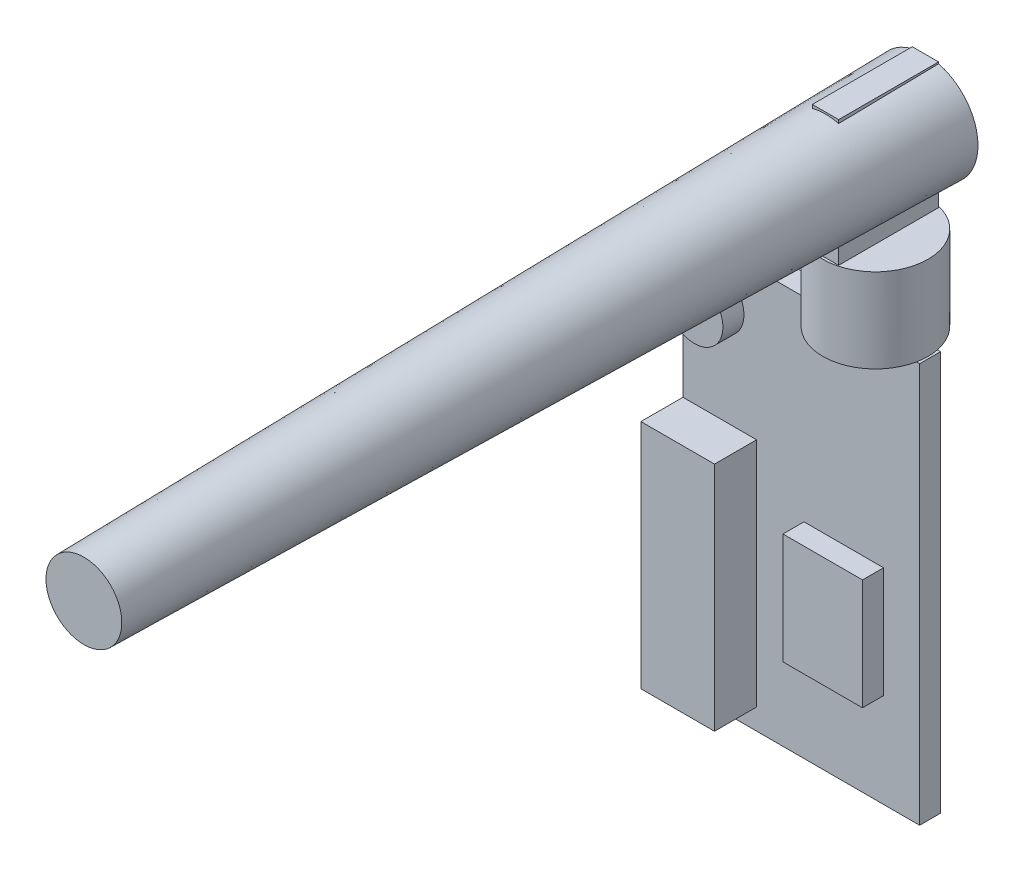
ISO-10303-21;
HEADER;
FILE_DESCRIPTION(('STEP AP214'),'2;1');
FILE_NAME('part.step','',(''),(''),'','','');
FILE_SCHEMA(('AUTOMOTIVE_DESIGN { 1 0 10303 214 1 1 1 1 }'));
ENDSEC;
DATA;
#1=APPLICATION_CONTEXT('core data for automotive mechanical design processes');
#2=APPLICATION_PROTOCOL_DEFINITION('international standard','automotive_design',2000,#1);
#3=PRODUCT_CONTEXT('',#1,'mechanical');
#4=PRODUCT('Part','Part','',(#3));
#5=PRODUCT_RELATED_PRODUCT_CATEGORY('part','',(#4));
#6=PRODUCT_DEFINITION_FORMATION('','',#4);
#7=PRODUCT_DEFINITION_CONTEXT('part definition',#1,'design');
#8=PRODUCT_DEFINITION('design','',#6,#7);
#9=PRODUCT_DEFINITION_SHAPE('','',#8);
#10=(LENGTH_UNIT() NAMED_UNIT(*) SI_UNIT(.MILLI.,.METRE.));
#11=(NAMED_UNIT(*) PLANE_ANGLE_UNIT() SI_UNIT($,.RADIAN.));
#12=(NAMED_UNIT(*) SI_UNIT($,.STERADIAN.) SOLID_ANGLE_UNIT());
#13=UNCERTAINTY_MEASURE_WITH_UNIT(LENGTH_MEASURE(1.E-05),#10,'distance_accuracy_value','');
#14=(GEOMETRIC_REPRESENTATION_CONTEXT(3) GLOBAL_UNCERTAINTY_ASSIGNED_CONTEXT((#13)) GLOBAL_UNIT_ASSIGNED_CONTEXT((#10,
#11,#12)) REPRESENTATION_CONTEXT('',''));
#15=CARTESIAN_POINT('',(0.,0.,0.));
#16=DIRECTION('',(0.,0.,1.));
#17=DIRECTION('',(1.,0.,0.));
#18=AXIS2_PLACEMENT_3D('',#15,#16,#17);
#19=CARTESIAN_POINT('',(7.3,27.,5.75));
#20=DIRECTION('',(1.,0.,0.));
#21=DIRECTION('',(0.,0.,-1.));
#22=AXIS2_PLACEMENT_3D('',#19,#20,#21);
#23=PLANE('',#22);
#24=CARTESIAN_POINT('',(7.3,29.0042749445332,-12.3283027239144));
#25=CARTESIAN_POINT('',(7.3,29.0629664221397,-9.06648061269329));
#26=CARTESIAN_POINT('',(7.3,29.1217172337511,-5.80465956799577));
#27=CARTESIAN_POINT('',(7.3,29.2393547379054,0.718980071111044));
#28=CARTESIAN_POINT('',(7.3,29.2982414304482,3.98079866552035));
#29=CARTESIAN_POINT('',(7.3,29.5084515527823,15.6095185434133));
#30=CARTESIAN_POINT('',(7.3,29.6602020962048,23.9764121052414));
#31=CARTESIAN_POINT('',(7.3,29.8126015581077,32.34329388351));
#32=B_SPLINE_CURVE_WITH_KNOTS('',3,(#24,#25,#26,#27,#28,#29,#30,#31),.UNSPECIFIED.,.F.,.F.,(4,2,
2,4),(0.,9.78705030118873,19.5741006026884,44.6789093603624),.UNSPECIFIED.);
#33=CARTESIAN_POINT('',(7.3,29.3302284704827,5.75));
#34=VERTEX_POINT('',#33);
#35=CARTESIAN_POINT('',(7.3,29.1587708172407,-3.75));
#36=VERTEX_POINT('',#35);
#37=EDGE_CURVE('E220',#34,#36,#32,.F.);
#38=ORIENTED_EDGE('',*,*,#37,.F.);
#39=DIRECTION('',(0.,1.,0.));
#40=VECTOR('',#39,1.);
#41=CARTESIAN_POINT('',(7.3,27.,5.75));
#42=LINE('',#41,#40);
#43=CARTESIAN_POINT('',(7.3,27.,5.75));
#44=VERTEX_POINT('',#43);
#45=EDGE_CURVE('E651',#44,#34,#42,.T.);
#46=ORIENTED_EDGE('',*,*,#45,.F.);
#47=DIRECTION('',(0.,0.,-1.));
#48=VECTOR('',#47,1.);
#49=CARTESIAN_POINT('',(7.3,27.,5.75));
#50=LINE('',#49,#48);
#51=CARTESIAN_POINT('',(7.3,27.,-3.75));
#52=VERTEX_POINT('',#51);
#53=EDGE_CURVE('E636',#44,#52,#50,.T.);
#54=ORIENTED_EDGE('',*,*,#53,.T.);
#55=DIRECTION('',(0.,1.,0.));
#56=VECTOR('',#55,1.);
#57=CARTESIAN_POINT('',(7.3,27.,-3.75));
#58=LINE('',#57,#56);
#59=EDGE_CURVE('E235',#52,#36,#58,.T.);
#60=ORIENTED_EDGE('',*,*,#59,.T.);
#61=EDGE_LOOP('',(#38,#46,#54,#60));
#62=FACE_BOUND('',#61,.T.);
#63=ADVANCED_FACE('F36',(#62),#23,.T.);
#64=CARTESIAN_POINT('',(4.8,27.,5.75));
#65=DIRECTION('',(0.,0.,1.));
#66=DIRECTION('',(1.,0.,0.));
#67=AXIS2_PLACEMENT_3D('',#64,#65,#66);
#68=PLANE('',#67);
#69=CARTESIAN_POINT('',(6.05,34.,5.75));
#70=DIRECTION('',(0.,0.,1.));
#71=DIRECTION('',(1.,0.,0.));
#72=AXIS2_PLACEMENT_3D('',#69,#70,#71);
#73=CIRCLE('',#72,4.83417688318193);
#74=CARTESIAN_POINT('',(7.3,38.6697715295173,5.75));
#75=VERTEX_POINT('',#74);
#76=CARTESIAN_POINT('',(4.8,38.6697715295173,5.75));
#77=VERTEX_POINT('',#76);
#78=EDGE_CURVE('E232',#75,#77,#73,.T.);
#79=ORIENTED_EDGE('',*,*,#78,.F.);
#80=CARTESIAN_POINT('',(7.3,39.,5.75));
#81=VERTEX_POINT('',#80);
#82=EDGE_CURVE('E230',#75,#81,#42,.T.);
#83=ORIENTED_EDGE('',*,*,#82,.T.);
#84=DIRECTION('',(1.,0.,0.));
#85=VECTOR('',#84,1.);
#86=CARTESIAN_POINT('',(4.8,39.,5.75));
#87=LINE('',#86,#85);
#88=CARTESIAN_POINT('',(4.8,39.,5.75));
#89=VERTEX_POINT('',#88);
#90=EDGE_CURVE('E640',#89,#81,#87,.T.);
#91=ORIENTED_EDGE('',*,*,#90,.F.);
#92=DIRECTION('',(0.,1.,0.));
#93=VECTOR('',#92,1.);
#94=CARTESIAN_POINT('',(4.8,27.,5.75));
#95=LINE('',#94,#93);
#96=EDGE_CURVE('E655',#77,#89,#95,.T.);
#97=ORIENTED_EDGE('',*,*,#96,.F.);
#98=EDGE_LOOP('',(#79,#83,#91,#97));
#99=FACE_BOUND('',#98,.T.);
#100=ADVANCED_FACE('F420',(#99),#68,.T.);
#101=CARTESIAN_POINT('',(4.8,27.,5.75));
#102=DIRECTION('',(-1.,0.,0.));
#103=DIRECTION('',(0.,0.,1.));
#104=AXIS2_PLACEMENT_3D('',#101,#102,#103);
#105=PLANE('',#104);
#106=CARTESIAN_POINT('',(4.8,29.0042749445332,-12.3283027239144));
#107=CARTESIAN_POINT('',(4.8,29.0629664221397,-9.06648061269329));
#108=CARTESIAN_POINT('',(4.8,29.1217172337511,-5.80465956799577));
#109=CARTESIAN_POINT('',(4.8,29.2393547379054,0.718980071111044));
#110=CARTESIAN_POINT('',(4.8,29.2982414304482,3.98079866552035));
#111=CARTESIAN_POINT('',(4.8,29.5084515527823,15.6095185434133));
#112=CARTESIAN_POINT('',(4.8,29.6602020962048,23.9764121052414));
#113=CARTESIAN_POINT('',(4.8,29.8126015581077,32.34329388351));
#114=B_SPLINE_CURVE_WITH_KNOTS('',3,(#106,#107,#108,#109,#110,#111,#112,#113),.UNSPECIFIED.,.F.,
.F.,(4,2,2,4),(0.,9.78705030118873,19.5741006026884,44.6789093603624),.UNSPECIFIED.);
#115=CARTESIAN_POINT('',(4.8,29.1587708172407,-3.75));
#116=VERTEX_POINT('',#115);
#117=CARTESIAN_POINT('',(4.8,29.3302284704827,5.75));
#118=VERTEX_POINT('',#117);
#119=EDGE_CURVE('E231',#116,#118,#114,.T.);
#120=ORIENTED_EDGE('',*,*,#119,.F.);
#121=DIRECTION('',(0.,1.,0.));
#122=VECTOR('',#121,1.);
#123=CARTESIAN_POINT('',(4.8,27.,-3.75));
#124=LINE('',#123,#122);
#125=CARTESIAN_POINT('',(4.8,27.,-3.75));
#126=VERTEX_POINT('',#125);
#127=EDGE_CURVE('E243',#126,#116,#124,.T.);
#128=ORIENTED_EDGE('',*,*,#127,.F.);
#129=DIRECTION('',(0.,0.,1.));
#130=VECTOR('',#129,1.);
#131=CARTESIAN_POINT('',(4.8,27.,5.75));
#132=LINE('',#131,#130);
#133=CARTESIAN_POINT('',(4.8,27.,5.75));
#134=VERTEX_POINT('',#133);
#135=EDGE_CURVE('E240',#126,#134,#132,.T.);
#136=ORIENTED_EDGE('',*,*,#135,.T.);
#137=EDGE_CURVE('E653',#134,#118,#95,.T.);
#138=ORIENTED_EDGE('',*,*,#137,.T.);
#139=EDGE_LOOP('',(#120,#128,#136,#138));
#140=FACE_BOUND('',#139,.T.);
#141=ADVANCED_FACE('F426',(#140),#105,.T.);
#142=CARTESIAN_POINT('',(6.05,39.,1.));
#143=DIRECTION('',(0.,-1.,0.));
#144=DIRECTION('',(0.,0.,-1.));
#145=AXIS2_PLACEMENT_3D('',#142,#143,#144);
#146=CYLINDRICAL_SURFACE('',#145,5.);
#147=CARTESIAN_POINT('',(6.05,19.,1.));
#148=DIRECTION('',(0.,1.,0.));
#149=DIRECTION('',(0.,0.,1.));
#150=AXIS2_PLACEMENT_3D('',#147,#148,#149);
#151=CIRCLE('',#150,5.);
#152=CARTESIAN_POINT('',(10.9489794855664,19.,2.));
#153=VERTEX_POINT('',#152);
#154=CARTESIAN_POINT('',(10.9489794855664,19.,0.));
#155=VERTEX_POINT('',#154);
#156=EDGE_CURVE('E47',#153,#155,#151,.T.);
#157=ORIENTED_EDGE('',*,*,#156,.T.);
#158=CARTESIAN_POINT('',(1.15102051443364,19.,0.));
#159=VERTEX_POINT('',#158);
#160=EDGE_CURVE('E48',#155,#159,#151,.T.);
#161=ORIENTED_EDGE('',*,*,#160,.T.);
#162=CARTESIAN_POINT('',(1.15102051443364,19.,2.));
#163=VERTEX_POINT('',#162);
#164=EDGE_CURVE('E12',#159,#163,#151,.T.);
#165=ORIENTED_EDGE('',*,*,#164,.T.);
#166=EDGE_CURVE('E248',#163,#153,#151,.T.);
#167=ORIENTED_EDGE('',*,*,#166,.T.);
#168=EDGE_LOOP('',(#157,#161,#165,#167));
#169=FACE_BOUND('',#168,.T.);
#170=CARTESIAN_POINT('',(6.05,27.,1.));
#171=DIRECTION('',(0.,1.,0.));
#172=DIRECTION('',(0.,0.,1.));
#173=AXIS2_PLACEMENT_3D('',#170,#171,#172);
#174=CIRCLE('',#173,5.);
#175=CARTESIAN_POINT('',(6.05,27.,6.));
#176=VERTEX_POINT('',#175);
#177=EDGE_CURVE('E40',#176,#176,#174,.T.);
#178=ORIENTED_EDGE('',*,*,#177,.F.);
#179=EDGE_LOOP('',(#178));
#180=FACE_BOUND('',#179,.T.);
#181=ADVANCED_FACE('F455',(#169,#180),#146,.T.);
#182=CARTESIAN_POINT('',(-11.25,19.,2.));
#183=DIRECTION('',(0.,-1.,0.));
#184=DIRECTION('',(0.,0.,-1.));
#185=AXIS2_PLACEMENT_3D('',#182,#183,#184);
#186=PLANE('',#185);
#187=ORIENTED_EDGE('',*,*,#156,.F.);
#188=DIRECTION('',(-1.,0.,0.));
#189=VECTOR('',#188,1.);
#190=CARTESIAN_POINT('',(-11.25,19.,2.));
#191=LINE('',#190,#189);
#192=CARTESIAN_POINT('',(11.25,19.,2.));
#193=VERTEX_POINT('',#192);
#194=EDGE_CURVE('E352',#193,#153,#191,.T.);
#195=ORIENTED_EDGE('',*,*,#194,.F.);
#196=DIRECTION('',(0.,0.,-1.));
#197=VECTOR('',#196,1.);
#198=CARTESIAN_POINT('',(11.25,19.,2.));
#199=LINE('',#198,#197);
#200=CARTESIAN_POINT('',(11.25,19.,0.));
#201=VERTEX_POINT('',#200);
#202=EDGE_CURVE('E380',#193,#201,#199,.T.);
#203=ORIENTED_EDGE('',*,*,#202,.T.);
#204=DIRECTION('',(-1.,0.,0.));
#205=VECTOR('',#204,1.);
#206=CARTESIAN_POINT('',(-11.25,19.,0.));
#207=LINE('',#206,#205);
#208=EDGE_CURVE('E365',#201,#155,#207,.T.);
#209=ORIENTED_EDGE('',*,*,#208,.T.);
#210=EDGE_LOOP('',(#187,#195,#203,#209));
#211=FACE_BOUND('',#210,.T.);
#212=ADVANCED_FACE('F390',(#211),#186,.F.);
#213=CARTESIAN_POINT('',(0.,0.,2.));
#214=DIRECTION('',(0.,0.,-1.));
#215=DIRECTION('',(-1.,0.,0.));
#216=AXIS2_PLACEMENT_3D('',#213,#214,#215);
#217=PLANE('',#216);
#218=DIRECTION('',(-1.,0.,0.));
#219=VECTOR('',#218,1.);
#220=CARTESIAN_POINT('',(-11.25,4.98891696189728,2.));
#221=LINE('',#220,#219);
#222=CARTESIAN_POINT('',(-4.25,4.98891696189728,2.));
#223=VERTEX_POINT('',#222);
#224=CARTESIAN_POINT('',(-11.25,4.98891696189728,2.));
#225=VERTEX_POINT('',#224);
#226=EDGE_CURVE('E321',#223,#225,#221,.T.);
#227=ORIENTED_EDGE('',*,*,#226,.F.);
#228=DIRECTION('',(0.,1.,0.));
#229=VECTOR('',#228,1.);
#230=CARTESIAN_POINT('',(-4.25,-17.0110830381027,2.));
#231=LINE('',#230,#229);
#232=CARTESIAN_POINT('',(-4.25,-17.0110830381027,2.));
#233=VERTEX_POINT('',#232);
#234=EDGE_CURVE('E330',#233,#223,#231,.T.);
#235=ORIENTED_EDGE('',*,*,#234,.F.);
#236=DIRECTION('',(1.,0.,0.));
#237=VECTOR('',#236,1.);
#238=CARTESIAN_POINT('',(-11.25,-17.0110830381027,2.));
#239=LINE('',#238,#237);
#240=CARTESIAN_POINT('',(-11.25,-17.0110830381027,2.));
#241=VERTEX_POINT('',#240);
#242=EDGE_CURVE('E316',#241,#233,#239,.T.);
#243=ORIENTED_EDGE('',*,*,#242,.F.);
#244=DIRECTION('',(0.,-1.,0.));
#245=VECTOR('',#244,1.);
#246=CARTESIAN_POINT('',(-11.25,-19.,2.));
#247=LINE('',#246,#245);
#248=CARTESIAN_POINT('',(-11.25,-19.,2.));
#249=VERTEX_POINT('',#248);
#250=EDGE_CURVE('E355',#241,#249,#247,.T.);
#251=ORIENTED_EDGE('',*,*,#250,.T.);
#252=DIRECTION('',(1.,0.,0.));
#253=VECTOR('',#252,1.);
#254=CARTESIAN_POINT('',(-11.25,-19.,2.));
#255=LINE('',#254,#253);
#256=CARTESIAN_POINT('',(11.25,-19.,2.));
#257=VERTEX_POINT('',#256);
#258=EDGE_CURVE('E359',#249,#257,#255,.T.);
#259=ORIENTED_EDGE('',*,*,#258,.T.);
#260=DIRECTION('',(0.,1.,0.));
#261=VECTOR('',#260,1.);
#262=CARTESIAN_POINT('',(11.25,-19.,2.));
#263=LINE('',#262,#261);
#264=EDGE_CURVE('E347',#257,#193,#263,.T.);
#265=ORIENTED_EDGE('',*,*,#264,.T.);
#266=ORIENTED_EDGE('',*,*,#194,.T.);
#267=EDGE_CURVE('E356',#153,#163,#191,.T.);
#268=ORIENTED_EDGE('',*,*,#267,.T.);
#269=CARTESIAN_POINT('',(-11.25,19.,2.));
#270=VERTEX_POINT('',#269);
#271=EDGE_CURVE('E350',#163,#270,#191,.T.);
#272=ORIENTED_EDGE('',*,*,#271,.T.);
#273=EDGE_CURVE('E357',#270,#225,#247,.T.);
#274=ORIENTED_EDGE('',*,*,#273,.T.);
#275=EDGE_LOOP('',(#227,#235,#243,#251,#259,#265,#266,#268,#272,#274));
#276=FACE_BOUND('',#275,.T.);
#277=CARTESIAN_POINT('',(-8.1582329796106,14.6633417415387,2.));
#278=DIRECTION('',(0.,0.,-1.));
#279=DIRECTION('',(-1.,0.,0.));
#280=AXIS2_PLACEMENT_3D('',#277,#278,#279);
#281=CIRCLE('',#280,2.70624692598176);
#282=CARTESIAN_POINT('',(-10.8644799055924,14.6633417415387,2.));
#283=VERTEX_POINT('',#282);
#284=EDGE_CURVE('E45',#283,#283,#281,.F.);
#285=ORIENTED_EDGE('',*,*,#284,.F.);
#286=EDGE_LOOP('',(#285));
#287=FACE_BOUND('',#286,.T.);
#288=DIRECTION('',(0.,1.,0.));
#289=VECTOR('',#288,1.);
#290=CARTESIAN_POINT('',(7.81682187393073,-10.0436376753237,2.));
#291=LINE('',#290,#289);
#292=CARTESIAN_POINT('',(7.81682187393073,-10.0436376753237,2.));
#293=VERTEX_POINT('',#292);
#294=CARTESIAN_POINT('',(7.81682187393073,0.486111861221161,2.));
#295=VERTEX_POINT('',#294);
#296=EDGE_CURVE('E274',#293,#295,#291,.T.);
#297=ORIENTED_EDGE('',*,*,#296,.F.);
#298=DIRECTION('',(1.,0.,0.));
#299=VECTOR('',#298,1.);
#300=CARTESIAN_POINT('',(0.253526754548261,-10.0436376753237,2.));
#301=LINE('',#300,#299);
#302=CARTESIAN_POINT('',(0.253526754548261,-10.0436376753237,2.));
#303=VERTEX_POINT('',#302);
#304=EDGE_CURVE('E285',#303,#293,#301,.T.);
#305=ORIENTED_EDGE('',*,*,#304,.F.);
#306=DIRECTION('',(0.,-1.,0.));
#307=VECTOR('',#306,1.);
#308=CARTESIAN_POINT('',(0.253526754548261,-10.0436376753237,2.));
#309=LINE('',#308,#307);
#310=CARTESIAN_POINT('',(0.253526754548261,0.486111861221161,2.));
#311=VERTEX_POINT('',#310);
#312=EDGE_CURVE('E297',#311,#303,#309,.T.);
#313=ORIENTED_EDGE('',*,*,#312,.F.);
#314=DIRECTION('',(-1.,0.,0.));
#315=VECTOR('',#314,1.);
#316=CARTESIAN_POINT('',(0.253526754548261,0.486111861221161,2.));
#317=LINE('',#316,#315);
#318=EDGE_CURVE('E294',#295,#311,#317,.T.);
#319=ORIENTED_EDGE('',*,*,#318,.F.);
#320=EDGE_LOOP('',(#297,#305,#313,#319));
#321=FACE_BOUND('',#320,.T.);
#322=ADVANCED_FACE('F387',(#276,#287,#321),#217,.F.);
#323=CARTESIAN_POINT('',(11.25,-19.,2.));
#324=DIRECTION('',(-1.,0.,0.));
#325=DIRECTION('',(0.,0.,1.));
#326=AXIS2_PLACEMENT_3D('',#323,#324,#325);
#327=PLANE('',#326);
#328=DIRECTION('',(0.,1.,0.));
#329=VECTOR('',#328,1.);
#330=CARTESIAN_POINT('',(11.25,-19.,0.));
#331=LINE('',#330,#329);
#332=CARTESIAN_POINT('',(11.25,-19.,0.));
#333=VERTEX_POINT('',#332);
#334=EDGE_CURVE('E346',#333,#201,#331,.T.);
#335=ORIENTED_EDGE('',*,*,#334,.T.);
#336=ORIENTED_EDGE('',*,*,#202,.F.);
#337=ORIENTED_EDGE('',*,*,#264,.F.);
#338=DIRECTION('',(0.,0.,-1.));
#339=VECTOR('',#338,1.);
#340=CARTESIAN_POINT('',(11.25,-19.,2.));
#341=LINE('',#340,#339);
#342=EDGE_CURVE('E361',#257,#333,#341,.T.);
#343=ORIENTED_EDGE('',*,*,#342,.T.);
#344=EDGE_LOOP('',(#335,#336,#337,#343));
#345=FACE_BOUND('',#344,.T.);
#346=ADVANCED_FACE('F38',(#345),#327,.F.);
#347=ORIENTED_EDGE('',*,*,#164,.F.);
#348=CARTESIAN_POINT('',(-11.25,19.,0.));
#349=VERTEX_POINT('',#348);
#350=EDGE_CURVE('E364',#159,#349,#207,.T.);
#351=ORIENTED_EDGE('',*,*,#350,.T.);
#352=DIRECTION('',(0.,0.,-1.));
#353=VECTOR('',#352,1.);
#354=CARTESIAN_POINT('',(-11.25,19.,2.));
#355=LINE('',#354,#353);
#356=EDGE_CURVE('E377',#270,#349,#355,.T.);
#357=ORIENTED_EDGE('',*,*,#356,.F.);
#358=ORIENTED_EDGE('',*,*,#271,.F.);
#359=EDGE_LOOP('',(#347,#351,#357,#358));
#360=FACE_BOUND('',#359,.T.);
#361=ADVANCED_FACE('F679',(#360),#186,.F.);
#362=CARTESIAN_POINT('',(-11.25,-19.,2.));
#363=DIRECTION('',(1.,0.,0.));
#364=DIRECTION('',(0.,0.,-1.));
#365=AXIS2_PLACEMENT_3D('',#362,#363,#364);
#366=PLANE('',#365);
#367=DIRECTION('',(0.,0.,-1.));
#368=VECTOR('',#367,1.);
#369=CARTESIAN_POINT('',(-11.25,3.48226876309405,1.47900904600495));
#370=LINE('',#369,#368);
#371=CARTESIAN_POINT('',(-11.25,3.48226876309405,5.00130388683561));
#372=VERTEX_POINT('',#371);
#373=CARTESIAN_POINT('',(-11.25,3.48226876309405,1.47900904600495));
#374=VERTEX_POINT('',#373);
#375=EDGE_CURVE('E264',#372,#374,#370,.T.);
#376=ORIENTED_EDGE('',*,*,#375,.F.);
#377=DIRECTION('',(0.,1.,0.));
#378=VECTOR('',#377,1.);
#379=CARTESIAN_POINT('',(-11.25,-15.4100399286342,5.00130388683561));
#380=LINE('',#379,#378);
#381=CARTESIAN_POINT('',(-11.25,-15.4100399286342,5.00130388683561));
#382=VERTEX_POINT('',#381);
#383=EDGE_CURVE('E247',#382,#372,#380,.T.);
#384=ORIENTED_EDGE('',*,*,#383,.F.);
#385=DIRECTION('',(0.,0.,1.));
#386=VECTOR('',#385,1.);
#387=CARTESIAN_POINT('',(-11.25,-15.4100399286342,1.47900904600495));
#388=LINE('',#387,#386);
#389=CARTESIAN_POINT('',(-11.25,-15.4100399286342,1.47900904600495));
#390=VERTEX_POINT('',#389);
#391=EDGE_CURVE('E253',#390,#382,#388,.T.);
#392=ORIENTED_EDGE('',*,*,#391,.F.);
#393=DIRECTION('',(0.,-1.,0.));
#394=VECTOR('',#393,1.);
#395=CARTESIAN_POINT('',(-11.25,-15.4100399286342,1.47900904600495));
#396=LINE('',#395,#394);
#397=EDGE_CURVE('E267',#374,#390,#396,.T.);
#398=ORIENTED_EDGE('',*,*,#397,.F.);
#399=EDGE_LOOP('',(#376,#384,#392,#398));
#400=FACE_BOUND('',#399,.T.);
#401=DIRECTION('',(0.,-1.,0.));
#402=VECTOR('',#401,1.);
#403=CARTESIAN_POINT('',(-11.25,-19.,0.));
#404=LINE('',#403,#402);
#405=CARTESIAN_POINT('',(-11.25,-19.,0.));
#406=VERTEX_POINT('',#405);
#407=EDGE_CURVE('E368',#349,#406,#404,.T.);
#408=ORIENTED_EDGE('',*,*,#407,.T.);
#409=DIRECTION('',(0.,0.,-1.));
#410=VECTOR('',#409,1.);
#411=CARTESIAN_POINT('',(-11.25,-19.,2.));
#412=LINE('',#411,#410);
#413=EDGE_CURVE('E374',#249,#406,#412,.T.);
#414=ORIENTED_EDGE('',*,*,#413,.F.);
#415=ORIENTED_EDGE('',*,*,#250,.F.);
#416=DIRECTION('',(0.,0.,-1.));
#417=VECTOR('',#416,1.);
#418=CARTESIAN_POINT('',(-11.25,-17.0110830381027,6.));
#419=LINE('',#418,#417);
#420=CARTESIAN_POINT('',(-11.25,-17.0110830381027,6.));
#421=VERTEX_POINT('',#420);
#422=EDGE_CURVE('E343',#421,#241,#419,.T.);
#423=ORIENTED_EDGE('',*,*,#422,.F.);
#424=DIRECTION('',(0.,-1.,0.));
#425=VECTOR('',#424,1.);
#426=CARTESIAN_POINT('',(-11.25,-17.0110830381027,6.));
#427=LINE('',#426,#425);
#428=CARTESIAN_POINT('',(-11.25,4.98891696189728,6.));
#429=VERTEX_POINT('',#428);
#430=EDGE_CURVE('E317',#429,#421,#427,.T.);
#431=ORIENTED_EDGE('',*,*,#430,.F.);
#432=DIRECTION('',(0.,0.,-1.));
#433=VECTOR('',#432,1.);
#434=CARTESIAN_POINT('',(-11.25,4.98891696189728,6.));
#435=LINE('',#434,#433);
#436=EDGE_CURVE('E327',#429,#225,#435,.T.);
#437=ORIENTED_EDGE('',*,*,#436,.T.);
#438=ORIENTED_EDGE('',*,*,#273,.F.);
#439=ORIENTED_EDGE('',*,*,#356,.T.);
#440=EDGE_LOOP('',(#408,#414,#415,#423,#431,#437,#438,#439));
#441=FACE_BOUND('',#440,.T.);
#442=ADVANCED_FACE('F684',(#400,#441),#366,.F.);
#443=CARTESIAN_POINT('',(-11.25,-19.,2.));
#444=DIRECTION('',(0.,1.,0.));
#445=DIRECTION('',(0.,0.,1.));
#446=AXIS2_PLACEMENT_3D('',#443,#444,#445);
#447=PLANE('',#446);
#448=DIRECTION('',(1.,0.,0.));
#449=VECTOR('',#448,1.);
#450=CARTESIAN_POINT('',(-11.25,-19.,0.));
#451=LINE('',#450,#449);
#452=EDGE_CURVE('E351',#406,#333,#451,.T.);
#453=ORIENTED_EDGE('',*,*,#452,.T.);
#454=ORIENTED_EDGE('',*,*,#342,.F.);
#455=ORIENTED_EDGE('',*,*,#258,.F.);
#456=ORIENTED_EDGE('',*,*,#413,.T.);
#457=EDGE_LOOP('',(#453,#454,#455,#456));
#458=FACE_BOUND('',#457,.T.);
#459=ADVANCED_FACE('F691',(#458),#447,.F.);
#460=CARTESIAN_POINT('',(0.,0.,0.));
#461=DIRECTION('',(0.,0.,-1.));
#462=DIRECTION('',(-1.,0.,0.));
#463=AXIS2_PLACEMENT_3D('',#460,#461,#462);
#464=PLANE('',#463);
#465=ORIENTED_EDGE('',*,*,#334,.F.);
#466=ORIENTED_EDGE('',*,*,#452,.F.);
#467=ORIENTED_EDGE('',*,*,#407,.F.);
#468=ORIENTED_EDGE('',*,*,#350,.F.);
#469=EDGE_CURVE('E369',#155,#159,#207,.T.);
#470=ORIENTED_EDGE('',*,*,#469,.F.);
#471=ORIENTED_EDGE('',*,*,#208,.F.);
#472=EDGE_LOOP('',(#465,#466,#467,#468,#470,#471));
#473=FACE_BOUND('',#472,.T.);
#474=ADVANCED_FACE('F688',(#473),#464,.T.);
#475=CARTESIAN_POINT('',(-11.25,-17.0110830381027,6.));
#476=DIRECTION('',(0.,1.,0.));
#477=DIRECTION('',(0.,0.,1.));
#478=AXIS2_PLACEMENT_3D('',#475,#476,#477);
#479=PLANE('',#478);
#480=ORIENTED_EDGE('',*,*,#242,.T.);
#481=DIRECTION('',(0.,0.,-1.));
#482=VECTOR('',#481,1.);
#483=CARTESIAN_POINT('',(-4.25,-17.0110830381027,6.));
#484=LINE('',#483,#482);
#485=CARTESIAN_POINT('',(-4.25,-17.0110830381027,6.));
#486=VERTEX_POINT('',#485);
#487=EDGE_CURVE('E340',#486,#233,#484,.T.);
#488=ORIENTED_EDGE('',*,*,#487,.F.);
#489=DIRECTION('',(1.,0.,0.));
#490=VECTOR('',#489,1.);
#491=CARTESIAN_POINT('',(-11.25,-17.0110830381027,6.));
#492=LINE('',#491,#490);
#493=EDGE_CURVE('E320',#421,#486,#492,.T.);
#494=ORIENTED_EDGE('',*,*,#493,.F.);
#495=ORIENTED_EDGE('',*,*,#422,.T.);
#496=EDGE_LOOP('',(#480,#488,#494,#495));
#497=FACE_BOUND('',#496,.T.);
#498=ADVANCED_FACE('F701',(#497),#479,.F.);
#499=CARTESIAN_POINT('',(-4.25,-17.0110830381027,6.));
#500=DIRECTION('',(-1.,0.,0.));
#501=DIRECTION('',(0.,0.,1.));
#502=AXIS2_PLACEMENT_3D('',#499,#500,#501);
#503=PLANE('',#502);
#504=ORIENTED_EDGE('',*,*,#234,.T.);
#505=DIRECTION('',(0.,0.,-1.));
#506=VECTOR('',#505,1.);
#507=CARTESIAN_POINT('',(-4.25,4.98891696189728,6.));
#508=LINE('',#507,#506);
#509=CARTESIAN_POINT('',(-4.25,4.98891696189728,6.));
#510=VERTEX_POINT('',#509);
#511=EDGE_CURVE('E337',#510,#223,#508,.T.);
#512=ORIENTED_EDGE('',*,*,#511,.F.);
#513=DIRECTION('',(0.,1.,0.));
#514=VECTOR('',#513,1.);
#515=CARTESIAN_POINT('',(-4.25,-17.0110830381027,6.));
#516=LINE('',#515,#514);
#517=EDGE_CURVE('E323',#486,#510,#516,.T.);
#518=ORIENTED_EDGE('',*,*,#517,.F.);
#519=ORIENTED_EDGE('',*,*,#487,.T.);
#520=EDGE_LOOP('',(#504,#512,#518,#519));
#521=FACE_BOUND('',#520,.T.);
#522=ADVANCED_FACE('F712',(#521),#503,.F.);
#523=CARTESIAN_POINT('',(-11.25,4.98891696189728,6.));
#524=DIRECTION('',(0.,-1.,0.));
#525=DIRECTION('',(0.,0.,-1.));
#526=AXIS2_PLACEMENT_3D('',#523,#524,#525);
#527=PLANE('',#526);
#528=ORIENTED_EDGE('',*,*,#226,.T.);
#529=ORIENTED_EDGE('',*,*,#436,.F.);
#530=DIRECTION('',(-1.,0.,0.));
#531=VECTOR('',#530,1.);
#532=CARTESIAN_POINT('',(-11.25,4.98891696189728,6.));
#533=LINE('',#532,#531);
#534=EDGE_CURVE('E325',#510,#429,#533,.T.);
#535=ORIENTED_EDGE('',*,*,#534,.F.);
#536=ORIENTED_EDGE('',*,*,#511,.T.);
#537=EDGE_LOOP('',(#528,#529,#535,#536));
#538=FACE_BOUND('',#537,.T.);
#539=ADVANCED_FACE('F709',(#538),#527,.F.);
#540=CARTESIAN_POINT('',(0.,0.,6.));
#541=DIRECTION('',(0.,0.,-1.));
#542=DIRECTION('',(-1.,0.,0.));
#543=AXIS2_PLACEMENT_3D('',#540,#541,#542);
#544=PLANE('',#543);
#545=ORIENTED_EDGE('',*,*,#430,.T.);
#546=ORIENTED_EDGE('',*,*,#493,.T.);
#547=ORIENTED_EDGE('',*,*,#517,.T.);
#548=ORIENTED_EDGE('',*,*,#534,.T.);
#549=EDGE_LOOP('',(#545,#546,#547,#548));
#550=FACE_BOUND('',#549,.T.);
#551=ADVANCED_FACE('F705',(#550),#544,.F.);
#552=CARTESIAN_POINT('',(-8.1582329796106,14.6633417415387,4.));
#553=DIRECTION('',(0.,0.,-1.));
#554=DIRECTION('',(-1.,0.,0.));
#555=AXIS2_PLACEMENT_3D('',#552,#553,#554);
#556=CYLINDRICAL_SURFACE('',#555,2.70624692598176);
#557=CARTESIAN_POINT('',(-8.1582329796106,14.6633417415387,4.));
#558=DIRECTION('',(0.,0.,1.));
#559=DIRECTION('',(1.,0.,0.));
#560=AXIS2_PLACEMENT_3D('',#557,#558,#559);
#561=CIRCLE('',#560,2.70624692598176);
#562=CARTESIAN_POINT('',(-5.45198605362884,14.6633417415387,4.));
#563=VERTEX_POINT('',#562);
#564=EDGE_CURVE('E313',#563,#563,#561,.T.);
#565=ORIENTED_EDGE('',*,*,#564,.F.);
#566=EDGE_LOOP('',(#565));
#567=FACE_BOUND('',#566,.T.);
#568=ORIENTED_EDGE('',*,*,#284,.T.);
#569=EDGE_LOOP('',(#568));
#570=FACE_BOUND('',#569,.T.);
#571=ADVANCED_FACE('F385',(#567,#570),#556,.T.);
#572=CARTESIAN_POINT('',(-8.1582329796106,14.6633417415387,4.));
#573=DIRECTION('',(0.,0.,1.));
#574=DIRECTION('',(1.,0.,0.));
#575=AXIS2_PLACEMENT_3D('',#572,#573,#574);
#576=PLANE('',#575);
#577=ORIENTED_EDGE('',*,*,#564,.T.);
#578=EDGE_LOOP('',(#577));
#579=FACE_BOUND('',#578,.T.);
#580=ADVANCED_FACE('F417',(#579),#576,.T.);
#581=CARTESIAN_POINT('',(7.81682187393073,-10.0436376753237,4.));
#582=DIRECTION('',(-1.,0.,0.));
#583=DIRECTION('',(0.,0.,1.));
#584=AXIS2_PLACEMENT_3D('',#581,#582,#583);
#585=PLANE('',#584);
#586=ORIENTED_EDGE('',*,*,#296,.T.);
#587=DIRECTION('',(0.,0.,-1.));
#588=VECTOR('',#587,1.);
#589=CARTESIAN_POINT('',(7.81682187393073,0.486111861221161,4.));
#590=LINE('',#589,#588);
#591=CARTESIAN_POINT('',(7.81682187393073,0.486111861221161,4.));
#592=VERTEX_POINT('',#591);
#593=EDGE_CURVE('E310',#592,#295,#590,.T.);
#594=ORIENTED_EDGE('',*,*,#593,.F.);
#595=DIRECTION('',(0.,1.,0.));
#596=VECTOR('',#595,1.);
#597=CARTESIAN_POINT('',(7.81682187393073,-10.0436376753237,4.));
#598=LINE('',#597,#596);
#599=CARTESIAN_POINT('',(7.81682187393073,-10.0436376753237,4.));
#600=VERTEX_POINT('',#599);
#601=EDGE_CURVE('E281',#600,#592,#598,.T.);
#602=ORIENTED_EDGE('',*,*,#601,.F.);
#603=DIRECTION('',(0.,0.,-1.));
#604=VECTOR('',#603,1.);
#605=CARTESIAN_POINT('',(7.81682187393073,-10.0436376753237,4.));
#606=LINE('',#605,#604);
#607=EDGE_CURVE('E291',#600,#293,#606,.T.);
#608=ORIENTED_EDGE('',*,*,#607,.T.);
#609=EDGE_LOOP('',(#586,#594,#602,#608));
#610=FACE_BOUND('',#609,.T.);
#611=ADVANCED_FACE('F401',(#610),#585,.F.);
#612=CARTESIAN_POINT('',(0.253526754548261,0.486111861221161,4.));
#613=DIRECTION('',(0.,-1.,0.));
#614=DIRECTION('',(0.,0.,-1.));
#615=AXIS2_PLACEMENT_3D('',#612,#613,#614);
#616=PLANE('',#615);
#617=ORIENTED_EDGE('',*,*,#318,.T.);
#618=DIRECTION('',(0.,0.,-1.));
#619=VECTOR('',#618,1.);
#620=CARTESIAN_POINT('',(0.253526754548261,0.486111861221161,4.));
#621=LINE('',#620,#619);
#622=CARTESIAN_POINT('',(0.253526754548261,0.486111861221161,4.));
#623=VERTEX_POINT('',#622);
#624=EDGE_CURVE('E307',#623,#311,#621,.T.);
#625=ORIENTED_EDGE('',*,*,#624,.F.);
#626=DIRECTION('',(-1.,0.,0.));
#627=VECTOR('',#626,1.);
#628=CARTESIAN_POINT('',(0.253526754548261,0.486111861221161,4.));
#629=LINE('',#628,#627);
#630=EDGE_CURVE('E284',#592,#623,#629,.T.);
#631=ORIENTED_EDGE('',*,*,#630,.F.);
#632=ORIENTED_EDGE('',*,*,#593,.T.);
#633=EDGE_LOOP('',(#617,#625,#631,#632));
#634=FACE_BOUND('',#633,.T.);
#635=ADVANCED_FACE('F409',(#634),#616,.F.);
#636=CARTESIAN_POINT('',(0.253526754548261,-10.0436376753237,4.));
#637=DIRECTION('',(1.,0.,0.));
#638=DIRECTION('',(0.,0.,-1.));
#639=AXIS2_PLACEMENT_3D('',#636,#637,#638);
#640=PLANE('',#639);
#641=ORIENTED_EDGE('',*,*,#312,.T.);
#642=DIRECTION('',(0.,0.,-1.));
#643=VECTOR('',#642,1.);
#644=CARTESIAN_POINT('',(0.253526754548261,-10.0436376753237,4.));
#645=LINE('',#644,#643);
#646=CARTESIAN_POINT('',(0.253526754548261,-10.0436376753237,4.));
#647=VERTEX_POINT('',#646);
#648=EDGE_CURVE('E304',#647,#303,#645,.T.);
#649=ORIENTED_EDGE('',*,*,#648,.F.);
#650=DIRECTION('',(0.,-1.,0.));
#651=VECTOR('',#650,1.);
#652=CARTESIAN_POINT('',(0.253526754548261,-10.0436376753237,4.));
#653=LINE('',#652,#651);
#654=EDGE_CURVE('E287',#623,#647,#653,.T.);
#655=ORIENTED_EDGE('',*,*,#654,.F.);
#656=ORIENTED_EDGE('',*,*,#624,.T.);
#657=EDGE_LOOP('',(#641,#649,#655,#656));
#658=FACE_BOUND('',#657,.T.);
#659=ADVANCED_FACE('F407',(#658),#640,.F.);
#660=CARTESIAN_POINT('',(0.253526754548261,-10.0436376753237,4.));
#661=DIRECTION('',(0.,1.,0.));
#662=DIRECTION('',(0.,0.,1.));
#663=AXIS2_PLACEMENT_3D('',#660,#661,#662);
#664=PLANE('',#663);
#665=ORIENTED_EDGE('',*,*,#304,.T.);
#666=ORIENTED_EDGE('',*,*,#607,.F.);
#667=DIRECTION('',(1.,0.,0.));
#668=VECTOR('',#667,1.);
#669=CARTESIAN_POINT('',(0.253526754548261,-10.0436376753237,4.));
#670=LINE('',#669,#668);
#671=EDGE_CURVE('E289',#647,#600,#670,.T.);
#672=ORIENTED_EDGE('',*,*,#671,.F.);
#673=ORIENTED_EDGE('',*,*,#648,.T.);
#674=EDGE_LOOP('',(#665,#666,#672,#673));
#675=FACE_BOUND('',#674,.T.);
#676=ADVANCED_FACE('F397',(#675),#664,.F.);
#677=CARTESIAN_POINT('',(0.,0.,4.));
#678=DIRECTION('',(0.,0.,-1.));
#679=DIRECTION('',(-1.,0.,0.));
#680=AXIS2_PLACEMENT_3D('',#677,#678,#679);
#681=PLANE('',#680);
#682=ORIENTED_EDGE('',*,*,#601,.T.);
#683=ORIENTED_EDGE('',*,*,#630,.T.);
#684=ORIENTED_EDGE('',*,*,#654,.T.);
#685=ORIENTED_EDGE('',*,*,#671,.T.);
#686=EDGE_LOOP('',(#682,#683,#684,#685));
#687=FACE_BOUND('',#686,.T.);
#688=ADVANCED_FACE('F403',(#687),#681,.F.);
#689=CARTESIAN_POINT('',(-5.25,-15.4100399286342,5.00130388683561));
#690=DIRECTION('',(0.,0.,1.));
#691=DIRECTION('',(1.,0.,0.));
#692=AXIS2_PLACEMENT_3D('',#689,#690,#691);
#693=PLANE('',#692);
#694=ORIENTED_EDGE('',*,*,#383,.T.);
#695=DIRECTION('',(-1.,0.,0.));
#696=VECTOR('',#695,1.);
#697=CARTESIAN_POINT('',(-5.25,3.48226876309405,5.00130388683561));
#698=LINE('',#697,#696);
#699=CARTESIAN_POINT('',(-5.25,3.48226876309405,5.00130388683561));
#700=VERTEX_POINT('',#699);
#701=EDGE_CURVE('E262',#700,#372,#698,.T.);
#702=ORIENTED_EDGE('',*,*,#701,.F.);
#703=DIRECTION('',(0.,1.,0.));
#704=VECTOR('',#703,1.);
#705=CARTESIAN_POINT('',(-5.25,-15.4100399286342,5.00130388683561));
#706=LINE('',#705,#704);
#707=CARTESIAN_POINT('',(-5.25,-15.4100399286342,5.00130388683561));
#708=VERTEX_POINT('',#707);
#709=EDGE_CURVE('E249',#708,#700,#706,.T.);
#710=ORIENTED_EDGE('',*,*,#709,.F.);
#711=DIRECTION('',(-1.,0.,0.));
#712=VECTOR('',#711,1.);
#713=CARTESIAN_POINT('',(-5.25,-15.4100399286342,5.00130388683561));
#714=LINE('',#713,#712);
#715=EDGE_CURVE('E272',#708,#382,#714,.T.);
#716=ORIENTED_EDGE('',*,*,#715,.T.);
#717=EDGE_LOOP('',(#694,#702,#710,#716));
#718=FACE_BOUND('',#717,.T.);
#719=ADVANCED_FACE('F468',(#718),#693,.F.);
#720=CARTESIAN_POINT('',(-5.25,-15.4100399286342,1.47900904600495));
#721=DIRECTION('',(0.,-1.,0.));
#722=DIRECTION('',(0.,0.,-1.));
#723=AXIS2_PLACEMENT_3D('',#720,#721,#722);
#724=PLANE('',#723);
#725=ORIENTED_EDGE('',*,*,#391,.T.);
#726=ORIENTED_EDGE('',*,*,#715,.F.);
#727=DIRECTION('',(0.,0.,1.));
#728=VECTOR('',#727,1.);
#729=CARTESIAN_POINT('',(-5.25,-15.4100399286342,1.47900904600495));
#730=LINE('',#729,#728);
#731=CARTESIAN_POINT('',(-5.25,-15.4100399286342,1.47900904600495));
#732=VERTEX_POINT('',#731);
#733=EDGE_CURVE('E259',#732,#708,#730,.T.);
#734=ORIENTED_EDGE('',*,*,#733,.F.);
#735=DIRECTION('',(-1.,0.,0.));
#736=VECTOR('',#735,1.);
#737=CARTESIAN_POINT('',(-5.25,-15.4100399286342,1.47900904600495));
#738=LINE('',#737,#736);
#739=EDGE_CURVE('E275',#732,#390,#738,.T.);
#740=ORIENTED_EDGE('',*,*,#739,.T.);
#741=EDGE_LOOP('',(#725,#726,#734,#740));
#742=FACE_BOUND('',#741,.T.);
#743=ADVANCED_FACE('F464',(#742),#724,.F.);
#744=CARTESIAN_POINT('',(-5.25,-15.4100399286342,1.47900904600495));
#745=DIRECTION('',(0.,0.,-1.));
#746=DIRECTION('',(-1.,0.,0.));
#747=AXIS2_PLACEMENT_3D('',#744,#745,#746);
#748=PLANE('',#747);
#749=ORIENTED_EDGE('',*,*,#397,.T.);
#750=ORIENTED_EDGE('',*,*,#739,.F.);
#751=DIRECTION('',(0.,-1.,0.));
#752=VECTOR('',#751,1.);
#753=CARTESIAN_POINT('',(-5.25,-15.4100399286342,1.47900904600495));
#754=LINE('',#753,#752);
#755=CARTESIAN_POINT('',(-5.25,3.48226876309405,1.47900904600495));
#756=VERTEX_POINT('',#755);
#757=EDGE_CURVE('E256',#756,#732,#754,.T.);
#758=ORIENTED_EDGE('',*,*,#757,.F.);
#759=DIRECTION('',(-1.,0.,0.));
#760=VECTOR('',#759,1.);
#761=CARTESIAN_POINT('',(-5.25,3.48226876309405,1.47900904600495));
#762=LINE('',#761,#760);
#763=EDGE_CURVE('E277',#756,#374,#762,.T.);
#764=ORIENTED_EDGE('',*,*,#763,.T.);
#765=EDGE_LOOP('',(#749,#750,#758,#764));
#766=FACE_BOUND('',#765,.T.);
#767=ADVANCED_FACE('F467',(#766),#748,.F.);
#768=CARTESIAN_POINT('',(-5.25,3.48226876309405,1.47900904600495));
#769=DIRECTION('',(0.,1.,0.));
#770=DIRECTION('',(0.,0.,1.));
#771=AXIS2_PLACEMENT_3D('',#768,#769,#770);
#772=PLANE('',#771);
#773=ORIENTED_EDGE('',*,*,#375,.T.);
#774=ORIENTED_EDGE('',*,*,#763,.F.);
#775=DIRECTION('',(0.,0.,-1.));
#776=VECTOR('',#775,1.);
#777=CARTESIAN_POINT('',(-5.25,3.48226876309405,1.47900904600495));
#778=LINE('',#777,#776);
#779=EDGE_CURVE('E252',#700,#756,#778,.T.);
#780=ORIENTED_EDGE('',*,*,#779,.F.);
#781=ORIENTED_EDGE('',*,*,#701,.T.);
#782=EDGE_LOOP('',(#773,#774,#780,#781));
#783=FACE_BOUND('',#782,.T.);
#784=ADVANCED_FACE('F462',(#783),#772,.F.);
#785=CARTESIAN_POINT('',(-5.25,0.,0.));
#786=DIRECTION('',(1.,0.,0.));
#787=DIRECTION('',(0.,0.,-1.));
#788=AXIS2_PLACEMENT_3D('',#785,#786,#787);
#789=PLANE('',#788);
#790=ORIENTED_EDGE('',*,*,#709,.T.);
#791=ORIENTED_EDGE('',*,*,#779,.T.);
#792=ORIENTED_EDGE('',*,*,#757,.T.);
#793=ORIENTED_EDGE('',*,*,#733,.T.);
#794=EDGE_LOOP('',(#790,#791,#792,#793));
#795=FACE_BOUND('',#794,.T.);
#796=ADVANCED_FACE('F459',(#795),#789,.F.);
#797=CARTESIAN_POINT('',(6.05,19.,1.));
#798=DIRECTION('',(0.,1.,0.));
#799=DIRECTION('',(0.,0.,1.));
#800=AXIS2_PLACEMENT_3D('',#797,#798,#799);
#801=PLANE('',#800);
#802=ORIENTED_EDGE('',*,*,#160,.F.);
#803=ORIENTED_EDGE('',*,*,#469,.T.);
#804=EDGE_LOOP('',(#802,#803));
#805=FACE_BOUND('',#804,.T.);
#806=ADVANCED_FACE('F446',(#805),#801,.F.);
#807=ORIENTED_EDGE('',*,*,#267,.F.);
#808=ORIENTED_EDGE('',*,*,#166,.F.);
#809=EDGE_LOOP('',(#807,#808));
#810=FACE_BOUND('',#809,.T.);
#811=ADVANCED_FACE('F441',(#810),#801,.F.);
#812=CARTESIAN_POINT('',(0.,27.,1.));
#813=DIRECTION('',(0.,1.,0.));
#814=DIRECTION('',(0.,0.,1.));
#815=AXIS2_PLACEMENT_3D('',#812,#813,#814);
#816=PLANE('',#815);
#817=DIRECTION('',(1.,0.,0.));
#818=VECTOR('',#817,1.);
#819=CARTESIAN_POINT('',(4.8,27.,5.75));
#820=LINE('',#819,#818);
#821=EDGE_CURVE('E236',#134,#44,#820,.T.);
#822=ORIENTED_EDGE('',*,*,#821,.F.);
#823=ORIENTED_EDGE('',*,*,#135,.F.);
#824=DIRECTION('',(-1.,0.,0.));
#825=VECTOR('',#824,1.);
#826=CARTESIAN_POINT('',(4.8,27.,-3.75));
#827=LINE('',#826,#825);
#828=EDGE_CURVE('E639',#52,#126,#827,.T.);
#829=ORIENTED_EDGE('',*,*,#828,.F.);
#830=ORIENTED_EDGE('',*,*,#53,.F.);
#831=EDGE_LOOP('',(#822,#823,#829,#830));
#832=FACE_BOUND('',#831,.T.);
#833=ORIENTED_EDGE('',*,*,#177,.T.);
#834=EDGE_LOOP('',(#833));
#835=FACE_BOUND('',#834,.T.);
#836=ADVANCED_FACE('F434',(#832,#835),#816,.T.);
#837=CARTESIAN_POINT('',(7.3,38.9957250554668,-12.3283027239144));
#838=CARTESIAN_POINT('',(7.3,38.9370335778603,-9.06648061269329));
#839=CARTESIAN_POINT('',(7.3,38.8782827662489,-5.80465956799577));
#840=CARTESIAN_POINT('',(7.3,38.7606452620946,0.718980071111044));
#841=CARTESIAN_POINT('',(7.3,38.7017585695518,3.98079866552035));
#842=CARTESIAN_POINT('',(7.3,38.4915484472178,15.6095185434133));
#843=CARTESIAN_POINT('',(7.3,38.3397979037952,23.9764121052414));
#844=CARTESIAN_POINT('',(7.3,38.1873984418923,32.34329388351));
#845=B_SPLINE_CURVE_WITH_KNOTS('',3,(#837,#838,#839,#840,#841,#842,#843,#844),.UNSPECIFIED.,.F.,
.F.,(4,2,2,4),(0.,9.78705030118873,19.5741006026884,44.6789093603624),.UNSPECIFIED.);
#846=CARTESIAN_POINT('',(7.3,38.8412291827593,-3.75));
#847=VERTEX_POINT('',#846);
#848=EDGE_CURVE('E217',#847,#75,#845,.T.);
#849=ORIENTED_EDGE('',*,*,#848,.F.);
#850=CARTESIAN_POINT('',(7.3,39.,-3.75));
#851=VERTEX_POINT('',#850);
#852=EDGE_CURVE('E229',#847,#851,#58,.T.);
#853=ORIENTED_EDGE('',*,*,#852,.T.);
#854=DIRECTION('',(0.,0.,-1.));
#855=VECTOR('',#854,1.);
#856=CARTESIAN_POINT('',(7.3,39.,5.75));
#857=LINE('',#856,#855);
#858=EDGE_CURVE('E635',#81,#851,#857,.T.);
#859=ORIENTED_EDGE('',*,*,#858,.F.);
#860=ORIENTED_EDGE('',*,*,#82,.F.);
#861=EDGE_LOOP('',(#849,#853,#859,#860));
#862=FACE_BOUND('',#861,.T.);
#863=ADVANCED_FACE('F227',(#862),#23,.T.);
#864=EDGE_CURVE('E628',#118,#34,#73,.T.);
#865=ORIENTED_EDGE('',*,*,#864,.F.);
#866=ORIENTED_EDGE('',*,*,#137,.F.);
#867=ORIENTED_EDGE('',*,*,#821,.T.);
#868=ORIENTED_EDGE('',*,*,#45,.T.);
#869=EDGE_LOOP('',(#865,#866,#867,#868));
#870=FACE_BOUND('',#869,.T.);
#871=ADVANCED_FACE('F429',(#870),#68,.T.);
#872=CARTESIAN_POINT('',(4.8,38.9957250554668,-12.3283027239144));
#873=CARTESIAN_POINT('',(4.8,38.9370335778603,-9.06648061269329));
#874=CARTESIAN_POINT('',(4.8,38.8782827662489,-5.80465956799577));
#875=CARTESIAN_POINT('',(4.8,38.7606452620946,0.718980071111044));
#876=CARTESIAN_POINT('',(4.8,38.7017585695518,3.98079866552035));
#877=CARTESIAN_POINT('',(4.8,38.4915484472178,15.6095185434133));
#878=CARTESIAN_POINT('',(4.8,38.3397979037952,23.9764121052414));
#879=CARTESIAN_POINT('',(4.8,38.1873984418923,32.34329388351));
#880=B_SPLINE_CURVE_WITH_KNOTS('',3,(#872,#873,#874,#875,#876,#877,#878,#879),.UNSPECIFIED.,.F.,
.F.,(4,2,2,4),(0.,9.78705030118873,19.5741006026884,44.6789093603624),.UNSPECIFIED.);
#881=CARTESIAN_POINT('',(4.8,38.8412291827593,-3.75));
#882=VERTEX_POINT('',#881);
#883=EDGE_CURVE('E613',#77,#882,#880,.F.);
#884=ORIENTED_EDGE('',*,*,#883,.F.);
#885=ORIENTED_EDGE('',*,*,#96,.T.);
#886=DIRECTION('',(0.,0.,1.));
#887=VECTOR('',#886,1.);
#888=CARTESIAN_POINT('',(4.8,39.,5.75));
#889=LINE('',#888,#887);
#890=CARTESIAN_POINT('',(4.8,39.,-3.75));
#891=VERTEX_POINT('',#890);
#892=EDGE_CURVE('E647',#891,#89,#889,.T.);
#893=ORIENTED_EDGE('',*,*,#892,.F.);
#894=EDGE_CURVE('E238',#882,#891,#124,.T.);
#895=ORIENTED_EDGE('',*,*,#894,.F.);
#896=EDGE_LOOP('',(#884,#885,#893,#895));
#897=FACE_BOUND('',#896,.T.);
#898=ADVANCED_FACE('F439',(#897),#105,.T.);
#899=CARTESIAN_POINT('',(4.8,27.,-3.75));
#900=DIRECTION('',(0.,0.,-1.));
#901=DIRECTION('',(-1.,0.,0.));
#902=AXIS2_PLACEMENT_3D('',#899,#900,#901);
#903=PLANE('',#902);
#904=ORIENTED_EDGE('',*,*,#127,.T.);
#905=CARTESIAN_POINT('',(6.05,34.,-3.75));
#906=DIRECTION('',(0.,0.,-1.));
#907=DIRECTION('',(-1.,0.,0.));
#908=AXIS2_PLACEMENT_3D('',#905,#906,#907);
#909=CIRCLE('',#908,5.);
#910=EDGE_CURVE('E55',#116,#882,#909,.T.);
#911=ORIENTED_EDGE('',*,*,#910,.T.);
#912=ORIENTED_EDGE('',*,*,#894,.T.);
#913=DIRECTION('',(-1.,0.,0.));
#914=VECTOR('',#913,1.);
#915=CARTESIAN_POINT('',(4.8,39.,-3.75));
#916=LINE('',#915,#914);
#917=EDGE_CURVE('E63',#851,#891,#916,.T.);
#918=ORIENTED_EDGE('',*,*,#917,.F.);
#919=ORIENTED_EDGE('',*,*,#852,.F.);
#920=EDGE_CURVE('E214',#847,#36,#909,.T.);
#921=ORIENTED_EDGE('',*,*,#920,.T.);
#922=ORIENTED_EDGE('',*,*,#59,.F.);
#923=ORIENTED_EDGE('',*,*,#828,.T.);
#924=EDGE_LOOP('',(#904,#911,#912,#918,#919,#921,#922,#923));
#925=FACE_BOUND('',#924,.T.);
#926=ADVANCED_FACE('F234',(#925),#903,.T.);
#927=CARTESIAN_POINT('',(6.05,39.,1.));
#928=DIRECTION('',(0.,1.,0.));
#929=DIRECTION('',(0.,0.,1.));
#930=AXIS2_PLACEMENT_3D('',#927,#928,#929);
#931=PLANE('',#930);
#932=ORIENTED_EDGE('',*,*,#90,.T.);
#933=ORIENTED_EDGE('',*,*,#858,.T.);
#934=ORIENTED_EDGE('',*,*,#917,.T.);
#935=ORIENTED_EDGE('',*,*,#892,.T.);
#936=EDGE_LOOP('',(#932,#933,#934,#935));
#937=FACE_BOUND('',#936,.T.);
#938=ADVANCED_FACE('F452',(#937),#931,.T.);
#939=CARTESIAN_POINT('',(6.05,34.,-3.75));
#940=DIRECTION('',(0.,0.,-1.));
#941=DIRECTION('',(-1.,0.,0.));
#942=AXIS2_PLACEMENT_3D('',#939,#940,#941);
#943=CONICAL_SURFACE('',#942,5.,0.0174532925199433);
#944=CARTESIAN_POINT('',(6.05,34.,76.25));
#945=DIRECTION('',(0.,0.,-1.));
#946=DIRECTION('',(-1.,0.,0.));
#947=AXIS2_PLACEMENT_3D('',#944,#945,#946);
#948=CIRCLE('',#947,3.60359480574259);
#949=CARTESIAN_POINT('',(2.44640519425741,34.,76.25));
#950=VERTEX_POINT('',#949);
#951=EDGE_CURVE('E223',#950,#950,#948,.T.);
#952=ORIENTED_EDGE('',*,*,#951,.T.);
#953=EDGE_LOOP('',(#952));
#954=FACE_BOUND('',#953,.T.);
#955=ORIENTED_EDGE('',*,*,#864,.T.);
#956=ORIENTED_EDGE('',*,*,#37,.T.);
#957=ORIENTED_EDGE('',*,*,#920,.F.);
#958=ORIENTED_EDGE('',*,*,#848,.T.);
#959=ORIENTED_EDGE('',*,*,#78,.T.);
#960=ORIENTED_EDGE('',*,*,#883,.T.);
#961=ORIENTED_EDGE('',*,*,#910,.F.);
#962=ORIENTED_EDGE('',*,*,#119,.T.);
#963=EDGE_LOOP('',(#955,#956,#957,#958,#959,#960,#961,#962));
#964=FACE_BOUND('',#963,.T.);
#965=ADVANCED_FACE('F216',(#954,#964),#943,.T.);
#966=CARTESIAN_POINT('',(6.05,34.,76.25));
#967=DIRECTION('',(0.,0.,-1.));
#968=DIRECTION('',(-1.,0.,0.));
#969=AXIS2_PLACEMENT_3D('',#966,#967,#968);
#970=PLANE('',#969);
#971=ORIENTED_EDGE('',*,*,#951,.F.);
#972=EDGE_LOOP('',(#971));
#973=FACE_BOUND('',#972,.T.);
#974=ADVANCED_FACE('F594',(#973),#970,.F.);
#975=CLOSED_SHELL('',(#63,#100,#141,#181,#212,#322,#346,#361,#442,#459,#474,#498,#522,#539,#551,
#571,#580,#611,#635,#659,#676,#688,#719,#743,#767,#784,#796,#806,#811,#836,#863,#871,#898,#926,
#938,#965,#974));
#976=MANIFOLD_SOLID_BREP('B2',#975);
#977=ADVANCED_BREP_SHAPE_REPRESENTATION('',(#18,#976),#14);
#978=SHAPE_DEFINITION_REPRESENTATION(#9,#977);
ENDSEC;
END-ISO-10303-21;
